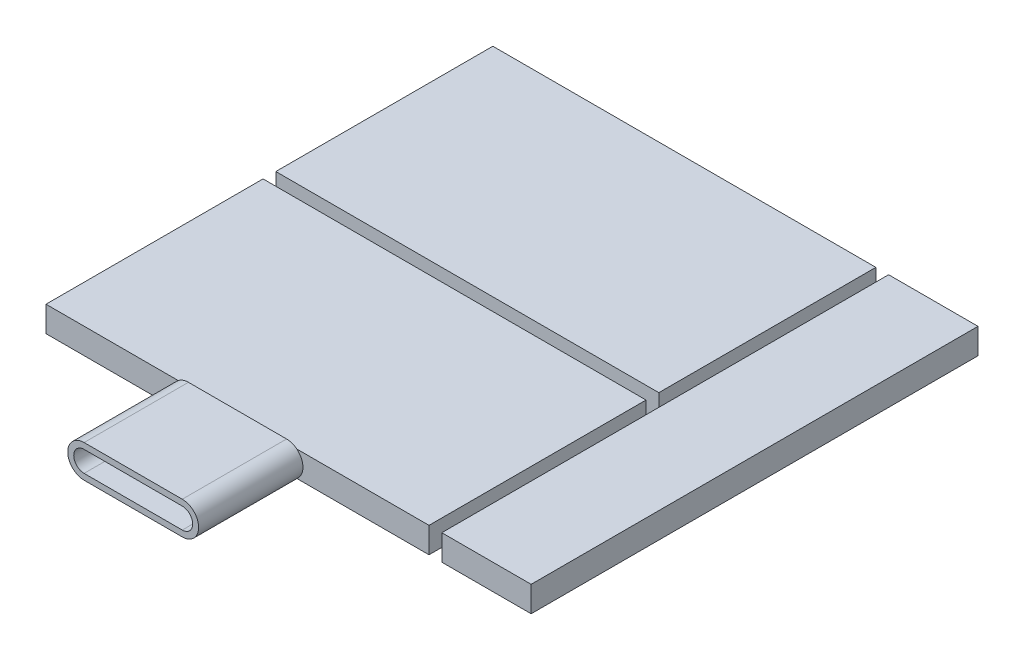
ISO-10303-21;
HEADER;
FILE_DESCRIPTION(('STEP AP214'),'2;1');
FILE_NAME('part.step','',(''),(''),'','','');
FILE_SCHEMA(('AUTOMOTIVE_DESIGN { 1 0 10303 214 1 1 1 1 }'));
ENDSEC;
DATA;
#1=APPLICATION_CONTEXT('core data for automotive mechanical design processes');
#2=APPLICATION_PROTOCOL_DEFINITION('international standard','automotive_design',2000,#1);
#3=PRODUCT_CONTEXT('',#1,'mechanical');
#4=PRODUCT('Part','Part','',(#3));
#5=PRODUCT_RELATED_PRODUCT_CATEGORY('part','',(#4));
#6=PRODUCT_DEFINITION_FORMATION('','',#4);
#7=PRODUCT_DEFINITION_CONTEXT('part definition',#1,'design');
#8=PRODUCT_DEFINITION('design','',#6,#7);
#9=PRODUCT_DEFINITION_SHAPE('','',#8);
#10=(LENGTH_UNIT() NAMED_UNIT(*) SI_UNIT(.MILLI.,.METRE.));
#11=(NAMED_UNIT(*) PLANE_ANGLE_UNIT() SI_UNIT($,.RADIAN.));
#12=(NAMED_UNIT(*) SI_UNIT($,.STERADIAN.) SOLID_ANGLE_UNIT());
#13=UNCERTAINTY_MEASURE_WITH_UNIT(LENGTH_MEASURE(1.E-05),#10,'distance_accuracy_value','');
#14=(GEOMETRIC_REPRESENTATION_CONTEXT(3) GLOBAL_UNCERTAINTY_ASSIGNED_CONTEXT((#13)) GLOBAL_UNIT_ASSIGNED_CONTEXT((#10,
#11,#12)) REPRESENTATION_CONTEXT('',''));
#15=CARTESIAN_POINT('',(0.,0.,0.));
#16=DIRECTION('',(0.,0.,1.));
#17=DIRECTION('',(1.,0.,0.));
#18=AXIS2_PLACEMENT_3D('',#15,#16,#17);
#19=CARTESIAN_POINT('',(-4.5,2.,17.5));
#20=DIRECTION('',(0.,0.,-1.));
#21=DIRECTION('',(-1.,0.,0.));
#22=AXIS2_PLACEMENT_3D('',#19,#20,#21);
#23=PLANE('',#22);
#24=CARTESIAN_POINT('',(-23.345,1.,17.5));
#25=DIRECTION('',(0.,0.,1.));
#26=DIRECTION('',(1.,0.,0.));
#27=AXIS2_PLACEMENT_3D('',#24,#25,#26);
#28=CIRCLE('',#27,1.28);
#29=CARTESIAN_POINT('',(-24.1439993742175,2.,17.5));
#30=VERTEX_POINT('',#29);
#31=CARTESIAN_POINT('',(-24.1439993742175,0.,17.5));
#32=VERTEX_POINT('',#31);
#33=EDGE_CURVE('E12',#30,#32,#28,.T.);
#34=ORIENTED_EDGE('',*,*,#33,.F.);
#35=DIRECTION('',(1.,0.,0.));
#36=VECTOR('',#35,1.);
#37=CARTESIAN_POINT('',(-4.5,2.,17.5));
#38=LINE('',#37,#36);
#39=CARTESIAN_POINT('',(-34.5,2.,17.5));
#40=VERTEX_POINT('',#39);
#41=EDGE_CURVE('E231',#40,#30,#38,.T.);
#42=ORIENTED_EDGE('',*,*,#41,.F.);
#43=DIRECTION('',(0.,-1.,0.));
#44=VECTOR('',#43,1.);
#45=CARTESIAN_POINT('',(-34.5,2.,17.5));
#46=LINE('',#45,#44);
#47=CARTESIAN_POINT('',(-34.5,0.,17.5));
#48=VERTEX_POINT('',#47);
#49=EDGE_CURVE('E246',#40,#48,#46,.T.);
#50=ORIENTED_EDGE('',*,*,#49,.T.);
#51=DIRECTION('',(1.,0.,0.));
#52=VECTOR('',#51,1.);
#53=CARTESIAN_POINT('',(-4.5,0.,17.5));
#54=LINE('',#53,#52);
#55=EDGE_CURVE('E226',#48,#32,#54,.T.);
#56=ORIENTED_EDGE('',*,*,#55,.T.);
#57=EDGE_LOOP('',(#34,#42,#50,#56));
#58=FACE_BOUND('',#57,.T.);
#59=ADVANCED_FACE('F46',(#58),#23,.F.);
#60=CARTESIAN_POINT('',(-15.655,1.,17.5));
#61=DIRECTION('',(0.,0.,1.));
#62=DIRECTION('',(1.,0.,0.));
#63=AXIS2_PLACEMENT_3D('',#60,#61,#62);
#64=CIRCLE('',#63,1.28);
#65=CARTESIAN_POINT('',(-14.8560006257825,0.,17.5));
#66=VERTEX_POINT('',#65);
#67=CARTESIAN_POINT('',(-14.8560006257825,2.,17.5));
#68=VERTEX_POINT('',#67);
#69=EDGE_CURVE('E55',#66,#68,#64,.T.);
#70=ORIENTED_EDGE('',*,*,#69,.F.);
#71=CARTESIAN_POINT('',(-4.5,0.,17.5));
#72=VERTEX_POINT('',#71);
#73=EDGE_CURVE('E241',#66,#72,#54,.T.);
#74=ORIENTED_EDGE('',*,*,#73,.T.);
#75=DIRECTION('',(0.,-1.,0.));
#76=VECTOR('',#75,1.);
#77=CARTESIAN_POINT('',(-4.5,2.,17.5));
#78=LINE('',#77,#76);
#79=CARTESIAN_POINT('',(-4.5,2.,17.5));
#80=VERTEX_POINT('',#79);
#81=EDGE_CURVE('E233',#80,#72,#78,.T.);
#82=ORIENTED_EDGE('',*,*,#81,.F.);
#83=EDGE_CURVE('E230',#68,#80,#38,.T.);
#84=ORIENTED_EDGE('',*,*,#83,.F.);
#85=EDGE_LOOP('',(#70,#74,#82,#84));
#86=FACE_BOUND('',#85,.T.);
#87=ADVANCED_FACE('F290',(#86),#23,.F.);
#88=CARTESIAN_POINT('',(-4.5,2.,17.5));
#89=DIRECTION('',(-1.,0.,0.));
#90=DIRECTION('',(0.,0.,1.));
#91=AXIS2_PLACEMENT_3D('',#88,#89,#90);
#92=PLANE('',#91);
#93=DIRECTION('',(0.,0.,-1.));
#94=VECTOR('',#93,1.);
#95=CARTESIAN_POINT('',(-4.5,0.,17.5));
#96=LINE('',#95,#94);
#97=CARTESIAN_POINT('',(-4.49999999999999,0.,0.499999999999997));
#98=VERTEX_POINT('',#97);
#99=EDGE_CURVE('E221',#72,#98,#96,.T.);
#100=ORIENTED_EDGE('',*,*,#99,.T.);
#101=DIRECTION('',(0.,-1.,0.));
#102=VECTOR('',#101,1.);
#103=CARTESIAN_POINT('',(-4.49999999999999,2.,0.499999999999997));
#104=LINE('',#103,#102);
#105=CARTESIAN_POINT('',(-4.49999999999999,2.,0.499999999999997));
#106=VERTEX_POINT('',#105);
#107=EDGE_CURVE('E50',#106,#98,#104,.T.);
#108=ORIENTED_EDGE('',*,*,#107,.F.);
#109=DIRECTION('',(0.,0.,-1.));
#110=VECTOR('',#109,1.);
#111=CARTESIAN_POINT('',(-4.5,2.,17.5));
#112=LINE('',#111,#110);
#113=EDGE_CURVE('E222',#80,#106,#112,.T.);
#114=ORIENTED_EDGE('',*,*,#113,.F.);
#115=ORIENTED_EDGE('',*,*,#81,.T.);
#116=EDGE_LOOP('',(#100,#108,#114,#115));
#117=FACE_BOUND('',#116,.T.);
#118=ADVANCED_FACE('F48',(#117),#92,.F.);
#119=CARTESIAN_POINT('',(-4.49999999999999,2.,0.499999999999997));
#120=DIRECTION('',(0.,0.,1.));
#121=DIRECTION('',(1.,0.,0.));
#122=AXIS2_PLACEMENT_3D('',#119,#120,#121);
#123=PLANE('',#122);
#124=DIRECTION('',(-1.,0.,0.));
#125=VECTOR('',#124,1.);
#126=CARTESIAN_POINT('',(-4.49999999999999,0.,0.499999999999997));
#127=LINE('',#126,#125);
#128=CARTESIAN_POINT('',(-34.5,0.,0.5));
#129=VERTEX_POINT('',#128);
#130=EDGE_CURVE('E237',#98,#129,#127,.T.);
#131=ORIENTED_EDGE('',*,*,#130,.T.);
#132=DIRECTION('',(0.,-1.,0.));
#133=VECTOR('',#132,1.);
#134=CARTESIAN_POINT('',(-34.5,2.,0.5));
#135=LINE('',#134,#133);
#136=CARTESIAN_POINT('',(-34.5,2.,0.5));
#137=VERTEX_POINT('',#136);
#138=EDGE_CURVE('E248',#137,#129,#135,.T.);
#139=ORIENTED_EDGE('',*,*,#138,.F.);
#140=DIRECTION('',(-1.,0.,0.));
#141=VECTOR('',#140,1.);
#142=CARTESIAN_POINT('',(-4.49999999999999,2.,0.499999999999997));
#143=LINE('',#142,#141);
#144=EDGE_CURVE('E225',#106,#137,#143,.T.);
#145=ORIENTED_EDGE('',*,*,#144,.F.);
#146=ORIENTED_EDGE('',*,*,#107,.T.);
#147=EDGE_LOOP('',(#131,#139,#145,#146));
#148=FACE_BOUND('',#147,.T.);
#149=ADVANCED_FACE('F296',(#148),#123,.F.);
#150=CARTESIAN_POINT('',(-34.5,2.,17.5));
#151=DIRECTION('',(1.,0.,0.));
#152=DIRECTION('',(0.,0.,-1.));
#153=AXIS2_PLACEMENT_3D('',#150,#151,#152);
#154=PLANE('',#153);
#155=DIRECTION('',(0.,0.,1.));
#156=VECTOR('',#155,1.);
#157=CARTESIAN_POINT('',(-34.5,0.,17.5));
#158=LINE('',#157,#156);
#159=EDGE_CURVE('E239',#129,#48,#158,.T.);
#160=ORIENTED_EDGE('',*,*,#159,.T.);
#161=ORIENTED_EDGE('',*,*,#49,.F.);
#162=DIRECTION('',(0.,0.,1.));
#163=VECTOR('',#162,1.);
#164=CARTESIAN_POINT('',(-34.5,2.,17.5));
#165=LINE('',#164,#163);
#166=EDGE_CURVE('E228',#137,#40,#165,.T.);
#167=ORIENTED_EDGE('',*,*,#166,.F.);
#168=ORIENTED_EDGE('',*,*,#138,.T.);
#169=EDGE_LOOP('',(#160,#161,#167,#168));
#170=FACE_BOUND('',#169,.T.);
#171=ADVANCED_FACE('F298',(#170),#154,.F.);
#172=CARTESIAN_POINT('',(0.,2.,0.));
#173=DIRECTION('',(0.,1.,0.));
#174=DIRECTION('',(0.,0.,1.));
#175=AXIS2_PLACEMENT_3D('',#172,#173,#174);
#176=PLANE('',#175);
#177=ORIENTED_EDGE('',*,*,#113,.T.);
#178=ORIENTED_EDGE('',*,*,#144,.T.);
#179=ORIENTED_EDGE('',*,*,#166,.T.);
#180=ORIENTED_EDGE('',*,*,#41,.T.);
#181=EDGE_CURVE('E234',#30,#68,#38,.T.);
#182=ORIENTED_EDGE('',*,*,#181,.T.);
#183=ORIENTED_EDGE('',*,*,#83,.T.);
#184=EDGE_LOOP('',(#177,#178,#179,#180,#182,#183));
#185=FACE_BOUND('',#184,.T.);
#186=ADVANCED_FACE('F300',(#185),#176,.T.);
#187=CARTESIAN_POINT('',(0.,0.,0.));
#188=DIRECTION('',(0.,1.,0.));
#189=DIRECTION('',(0.,0.,1.));
#190=AXIS2_PLACEMENT_3D('',#187,#188,#189);
#191=PLANE('',#190);
#192=ORIENTED_EDGE('',*,*,#99,.F.);
#193=ORIENTED_EDGE('',*,*,#73,.F.);
#194=EDGE_CURVE('E243',#32,#66,#54,.T.);
#195=ORIENTED_EDGE('',*,*,#194,.F.);
#196=ORIENTED_EDGE('',*,*,#55,.F.);
#197=ORIENTED_EDGE('',*,*,#159,.F.);
#198=ORIENTED_EDGE('',*,*,#130,.F.);
#199=EDGE_LOOP('',(#192,#193,#195,#196,#197,#198));
#200=FACE_BOUND('',#199,.T.);
#201=ADVANCED_FACE('F295',(#200),#191,.F.);
#202=CARTESIAN_POINT('',(-23.345,1.,17.5));
#203=DIRECTION('',(0.,0.,1.));
#204=DIRECTION('',(1.,0.,0.));
#205=AXIS2_PLACEMENT_3D('',#202,#203,#204);
#206=PLANE('',#205);
#207=CARTESIAN_POINT('',(-23.345,-0.279999999999999,17.5));
#208=VERTEX_POINT('',#207);
#209=EDGE_CURVE('E58',#32,#208,#28,.T.);
#210=ORIENTED_EDGE('',*,*,#209,.F.);
#211=ORIENTED_EDGE('',*,*,#194,.T.);
#212=CARTESIAN_POINT('',(-15.655,-0.279999999999998,17.5));
#213=VERTEX_POINT('',#212);
#214=EDGE_CURVE('E206',#213,#66,#64,.T.);
#215=ORIENTED_EDGE('',*,*,#214,.F.);
#216=DIRECTION('',(1.,0.,0.));
#217=VECTOR('',#216,1.);
#218=CARTESIAN_POINT('',(-23.345,-0.279999999999999,17.5));
#219=LINE('',#218,#217);
#220=EDGE_CURVE('E203',#208,#213,#219,.T.);
#221=ORIENTED_EDGE('',*,*,#220,.F.);
#222=EDGE_LOOP('',(#210,#211,#215,#221));
#223=FACE_BOUND('',#222,.T.);
#224=ADVANCED_FACE('F284',(#223),#206,.F.);
#225=CARTESIAN_POINT('',(-23.345,1.,25.67));
#226=DIRECTION('',(0.,0.,1.));
#227=DIRECTION('',(1.,0.,0.));
#228=AXIS2_PLACEMENT_3D('',#225,#226,#227);
#229=PLANE('',#228);
#230=CARTESIAN_POINT('',(-23.345,1.,25.67));
#231=DIRECTION('',(0.,0.,1.));
#232=DIRECTION('',(1.,0.,0.));
#233=AXIS2_PLACEMENT_3D('',#230,#231,#232);
#234=CIRCLE('',#233,1.28);
#235=CARTESIAN_POINT('',(-23.345,2.28,25.67));
#236=VERTEX_POINT('',#235);
#237=CARTESIAN_POINT('',(-23.345,-0.279999999999999,25.67));
#238=VERTEX_POINT('',#237);
#239=EDGE_CURVE('E191',#236,#238,#234,.T.);
#240=ORIENTED_EDGE('',*,*,#239,.T.);
#241=DIRECTION('',(1.,0.,0.));
#242=VECTOR('',#241,1.);
#243=CARTESIAN_POINT('',(-23.345,-0.279999999999999,25.67));
#244=LINE('',#243,#242);
#245=CARTESIAN_POINT('',(-15.655,-0.279999999999998,25.67));
#246=VERTEX_POINT('',#245);
#247=EDGE_CURVE('E194',#238,#246,#244,.T.);
#248=ORIENTED_EDGE('',*,*,#247,.T.);
#249=CARTESIAN_POINT('',(-15.655,1.,25.67));
#250=DIRECTION('',(0.,0.,1.));
#251=DIRECTION('',(1.,0.,0.));
#252=AXIS2_PLACEMENT_3D('',#249,#250,#251);
#253=CIRCLE('',#252,1.28);
#254=CARTESIAN_POINT('',(-15.655,2.28,25.67));
#255=VERTEX_POINT('',#254);
#256=EDGE_CURVE('E197',#246,#255,#253,.T.);
#257=ORIENTED_EDGE('',*,*,#256,.T.);
#258=DIRECTION('',(-1.,0.,0.));
#259=VECTOR('',#258,1.);
#260=CARTESIAN_POINT('',(-23.345,2.28,25.67));
#261=LINE('',#260,#259);
#262=EDGE_CURVE('E199',#255,#236,#261,.T.);
#263=ORIENTED_EDGE('',*,*,#262,.T.);
#264=EDGE_LOOP('',(#240,#248,#257,#263));
#265=FACE_BOUND('',#264,.T.);
#266=DIRECTION('',(1.,0.,0.));
#267=VECTOR('',#266,1.);
#268=CARTESIAN_POINT('',(-23.345,0.187609999517717,25.67));
#269=LINE('',#268,#267);
#270=CARTESIAN_POINT('',(-23.345,0.187609999517717,25.67));
#271=VERTEX_POINT('',#270);
#272=CARTESIAN_POINT('',(-15.655,0.187609999517718,25.67));
#273=VERTEX_POINT('',#272);
#274=EDGE_CURVE('E160',#271,#273,#269,.T.);
#275=ORIENTED_EDGE('',*,*,#274,.F.);
#276=CARTESIAN_POINT('',(-23.345,1.,25.67));
#277=DIRECTION('',(0.,0.,1.));
#278=DIRECTION('',(1.,0.,0.));
#279=AXIS2_PLACEMENT_3D('',#276,#277,#278);
#280=CIRCLE('',#279,0.812390000482283);
#281=CARTESIAN_POINT('',(-23.345,1.81239000048228,25.67));
#282=VERTEX_POINT('',#281);
#283=EDGE_CURVE('E152',#282,#271,#280,.T.);
#284=ORIENTED_EDGE('',*,*,#283,.F.);
#285=DIRECTION('',(-1.,0.,0.));
#286=VECTOR('',#285,1.);
#287=CARTESIAN_POINT('',(-23.345,1.81239000048228,25.67));
#288=LINE('',#287,#286);
#289=CARTESIAN_POINT('',(-15.655,1.81239000048228,25.67));
#290=VERTEX_POINT('',#289);
#291=EDGE_CURVE('E175',#290,#282,#288,.T.);
#292=ORIENTED_EDGE('',*,*,#291,.F.);
#293=CARTESIAN_POINT('',(-15.655,1.,25.67));
#294=DIRECTION('',(0.,0.,1.));
#295=DIRECTION('',(1.,0.,0.));
#296=AXIS2_PLACEMENT_3D('',#293,#294,#295);
#297=CIRCLE('',#296,0.812390000482283);
#298=EDGE_CURVE('E173',#273,#290,#297,.T.);
#299=ORIENTED_EDGE('',*,*,#298,.F.);
#300=EDGE_LOOP('',(#275,#284,#292,#299));
#301=FACE_BOUND('',#300,.T.);
#302=ADVANCED_FACE('F171',(#265,#301),#229,.T.);
#303=ORIENTED_EDGE('',*,*,#181,.F.);
#304=CARTESIAN_POINT('',(-23.345,2.28,17.5));
#305=VERTEX_POINT('',#304);
#306=EDGE_CURVE('E57',#305,#30,#28,.T.);
#307=ORIENTED_EDGE('',*,*,#306,.F.);
#308=DIRECTION('',(-1.,0.,0.));
#309=VECTOR('',#308,1.);
#310=CARTESIAN_POINT('',(-23.345,2.28,17.5));
#311=LINE('',#310,#309);
#312=CARTESIAN_POINT('',(-15.655,2.28,17.5));
#313=VERTEX_POINT('',#312);
#314=EDGE_CURVE('E195',#313,#305,#311,.T.);
#315=ORIENTED_EDGE('',*,*,#314,.F.);
#316=EDGE_CURVE('E205',#68,#313,#64,.T.);
#317=ORIENTED_EDGE('',*,*,#316,.F.);
#318=EDGE_LOOP('',(#303,#307,#315,#317));
#319=FACE_BOUND('',#318,.T.);
#320=ADVANCED_FACE('F271',(#319),#206,.F.);
#321=CARTESIAN_POINT('',(-23.345,1.,25.67));
#322=DIRECTION('',(0.,0.,-1.));
#323=DIRECTION('',(-1.,0.,0.));
#324=AXIS2_PLACEMENT_3D('',#321,#322,#323);
#325=CYLINDRICAL_SURFACE('',#324,1.28);
#326=ORIENTED_EDGE('',*,*,#306,.T.);
#327=ORIENTED_EDGE('',*,*,#33,.T.);
#328=ORIENTED_EDGE('',*,*,#209,.T.);
#329=DIRECTION('',(0.,0.,-1.));
#330=VECTOR('',#329,1.);
#331=CARTESIAN_POINT('',(-23.345,-0.279999999999999,25.67));
#332=LINE('',#331,#330);
#333=EDGE_CURVE('E218',#238,#208,#332,.T.);
#334=ORIENTED_EDGE('',*,*,#333,.F.);
#335=ORIENTED_EDGE('',*,*,#239,.F.);
#336=DIRECTION('',(0.,0.,-1.));
#337=VECTOR('',#336,1.);
#338=CARTESIAN_POINT('',(-23.345,2.28,25.67));
#339=LINE('',#338,#337);
#340=EDGE_CURVE('E200',#236,#305,#339,.T.);
#341=ORIENTED_EDGE('',*,*,#340,.T.);
#342=EDGE_LOOP('',(#326,#327,#328,#334,#335,#341));
#343=FACE_BOUND('',#342,.T.);
#344=ADVANCED_FACE('F273',(#343),#325,.T.);
#345=CARTESIAN_POINT('',(-23.345,-0.279999999999999,25.67));
#346=DIRECTION('',(0.,1.,0.));
#347=DIRECTION('',(-1.,0.,0.));
#348=AXIS2_PLACEMENT_3D('',#345,#346,#347);
#349=PLANE('',#348);
#350=ORIENTED_EDGE('',*,*,#220,.T.);
#351=DIRECTION('',(0.,0.,-1.));
#352=VECTOR('',#351,1.);
#353=CARTESIAN_POINT('',(-15.655,-0.279999999999998,25.67));
#354=LINE('',#353,#352);
#355=EDGE_CURVE('E215',#246,#213,#354,.T.);
#356=ORIENTED_EDGE('',*,*,#355,.F.);
#357=ORIENTED_EDGE('',*,*,#247,.F.);
#358=ORIENTED_EDGE('',*,*,#333,.T.);
#359=EDGE_LOOP('',(#350,#356,#357,#358));
#360=FACE_BOUND('',#359,.T.);
#361=ADVANCED_FACE('F336',(#360),#349,.F.);
#362=CARTESIAN_POINT('',(-15.655,1.,25.67));
#363=DIRECTION('',(0.,0.,-1.));
#364=DIRECTION('',(-1.,0.,0.));
#365=AXIS2_PLACEMENT_3D('',#362,#363,#364);
#366=CYLINDRICAL_SURFACE('',#365,1.28);
#367=ORIENTED_EDGE('',*,*,#214,.T.);
#368=ORIENTED_EDGE('',*,*,#69,.T.);
#369=ORIENTED_EDGE('',*,*,#316,.T.);
#370=DIRECTION('',(0.,0.,-1.));
#371=VECTOR('',#370,1.);
#372=CARTESIAN_POINT('',(-15.655,2.28,25.67));
#373=LINE('',#372,#371);
#374=EDGE_CURVE('E212',#255,#313,#373,.T.);
#375=ORIENTED_EDGE('',*,*,#374,.F.);
#376=ORIENTED_EDGE('',*,*,#256,.F.);
#377=ORIENTED_EDGE('',*,*,#355,.T.);
#378=EDGE_LOOP('',(#367,#368,#369,#375,#376,#377));
#379=FACE_BOUND('',#378,.T.);
#380=ADVANCED_FACE('F261',(#379),#366,.T.);
#381=CARTESIAN_POINT('',(-23.345,2.28,25.67));
#382=DIRECTION('',(0.,-1.,0.));
#383=DIRECTION('',(1.,0.,0.));
#384=AXIS2_PLACEMENT_3D('',#381,#382,#383);
#385=PLANE('',#384);
#386=ORIENTED_EDGE('',*,*,#314,.T.);
#387=ORIENTED_EDGE('',*,*,#340,.F.);
#388=ORIENTED_EDGE('',*,*,#262,.F.);
#389=ORIENTED_EDGE('',*,*,#374,.T.);
#390=EDGE_LOOP('',(#386,#387,#388,#389));
#391=FACE_BOUND('',#390,.T.);
#392=ADVANCED_FACE('F268',(#391),#385,.F.);
#393=CARTESIAN_POINT('',(-23.345,1.,25.67));
#394=DIRECTION('',(0.,0.,-1.));
#395=DIRECTION('',(-1.,0.,0.));
#396=AXIS2_PLACEMENT_3D('',#393,#394,#395);
#397=CYLINDRICAL_SURFACE('',#396,0.812390000482283);
#398=CARTESIAN_POINT('',(-23.345,1.,17.5));
#399=DIRECTION('',(0.,0.,1.));
#400=DIRECTION('',(1.,0.,0.));
#401=AXIS2_PLACEMENT_3D('',#398,#399,#400);
#402=CIRCLE('',#401,0.812390000482283);
#403=CARTESIAN_POINT('',(-23.345,1.81239000048228,17.5));
#404=VERTEX_POINT('',#403);
#405=CARTESIAN_POINT('',(-23.345,0.187609999517717,17.5));
#406=VERTEX_POINT('',#405);
#407=EDGE_CURVE('E179',#404,#406,#402,.T.);
#408=ORIENTED_EDGE('',*,*,#407,.F.);
#409=DIRECTION('',(0.,0.,-1.));
#410=VECTOR('',#409,1.);
#411=CARTESIAN_POINT('',(-23.345,1.81239000048228,25.67));
#412=LINE('',#411,#410);
#413=EDGE_CURVE('E65',#282,#404,#412,.T.);
#414=ORIENTED_EDGE('',*,*,#413,.F.);
#415=ORIENTED_EDGE('',*,*,#283,.T.);
#416=DIRECTION('',(0.,0.,-1.));
#417=VECTOR('',#416,1.);
#418=CARTESIAN_POINT('',(-23.345,0.187609999517717,25.67));
#419=LINE('',#418,#417);
#420=EDGE_CURVE('E155',#271,#406,#419,.T.);
#421=ORIENTED_EDGE('',*,*,#420,.T.);
#422=EDGE_LOOP('',(#408,#414,#415,#421));
#423=FACE_BOUND('',#422,.T.);
#424=ADVANCED_FACE('F154',(#423),#397,.F.);
#425=CARTESIAN_POINT('',(-23.345,0.187609999517717,25.67));
#426=DIRECTION('',(0.,1.,0.));
#427=DIRECTION('',(-1.,0.,0.));
#428=AXIS2_PLACEMENT_3D('',#425,#426,#427);
#429=PLANE('',#428);
#430=DIRECTION('',(1.,0.,0.));
#431=VECTOR('',#430,1.);
#432=CARTESIAN_POINT('',(-23.345,0.187609999517717,17.5));
#433=LINE('',#432,#431);
#434=CARTESIAN_POINT('',(-15.655,0.187609999517718,17.5));
#435=VERTEX_POINT('',#434);
#436=EDGE_CURVE('E167',#406,#435,#433,.T.);
#437=ORIENTED_EDGE('',*,*,#436,.F.);
#438=ORIENTED_EDGE('',*,*,#420,.F.);
#439=ORIENTED_EDGE('',*,*,#274,.T.);
#440=DIRECTION('',(0.,0.,-1.));
#441=VECTOR('',#440,1.);
#442=CARTESIAN_POINT('',(-15.655,0.187609999517718,25.67));
#443=LINE('',#442,#441);
#444=EDGE_CURVE('E168',#273,#435,#443,.T.);
#445=ORIENTED_EDGE('',*,*,#444,.T.);
#446=EDGE_LOOP('',(#437,#438,#439,#445));
#447=FACE_BOUND('',#446,.T.);
#448=ADVANCED_FACE('F164',(#447),#429,.T.);
#449=CARTESIAN_POINT('',(-15.655,1.,25.67));
#450=DIRECTION('',(0.,0.,-1.));
#451=DIRECTION('',(-1.,0.,0.));
#452=AXIS2_PLACEMENT_3D('',#449,#450,#451);
#453=CYLINDRICAL_SURFACE('',#452,0.812390000482283);
#454=CARTESIAN_POINT('',(-15.655,1.,17.5));
#455=DIRECTION('',(0.,0.,1.));
#456=DIRECTION('',(1.,0.,0.));
#457=AXIS2_PLACEMENT_3D('',#454,#455,#456);
#458=CIRCLE('',#457,0.812390000482283);
#459=CARTESIAN_POINT('',(-15.655,1.81239000048228,17.5));
#460=VERTEX_POINT('',#459);
#461=EDGE_CURVE('E182',#435,#460,#458,.T.);
#462=ORIENTED_EDGE('',*,*,#461,.F.);
#463=ORIENTED_EDGE('',*,*,#444,.F.);
#464=ORIENTED_EDGE('',*,*,#298,.T.);
#465=DIRECTION('',(0.,0.,-1.));
#466=VECTOR('',#465,1.);
#467=CARTESIAN_POINT('',(-15.655,1.81239000048228,25.67));
#468=LINE('',#467,#466);
#469=EDGE_CURVE('E188',#290,#460,#468,.T.);
#470=ORIENTED_EDGE('',*,*,#469,.T.);
#471=EDGE_LOOP('',(#462,#463,#464,#470));
#472=FACE_BOUND('',#471,.T.);
#473=ADVANCED_FACE('F315',(#472),#453,.F.);
#474=CARTESIAN_POINT('',(-23.345,1.81239000048228,25.67));
#475=DIRECTION('',(0.,-1.,0.));
#476=DIRECTION('',(1.,0.,0.));
#477=AXIS2_PLACEMENT_3D('',#474,#475,#476);
#478=PLANE('',#477);
#479=DIRECTION('',(-1.,0.,0.));
#480=VECTOR('',#479,1.);
#481=CARTESIAN_POINT('',(-23.345,1.81239000048228,17.5));
#482=LINE('',#481,#480);
#483=EDGE_CURVE('E161',#460,#404,#482,.T.);
#484=ORIENTED_EDGE('',*,*,#483,.F.);
#485=ORIENTED_EDGE('',*,*,#469,.F.);
#486=ORIENTED_EDGE('',*,*,#291,.T.);
#487=ORIENTED_EDGE('',*,*,#413,.T.);
#488=EDGE_LOOP('',(#484,#485,#486,#487));
#489=FACE_BOUND('',#488,.T.);
#490=ADVANCED_FACE('F310',(#489),#478,.T.);
#491=ORIENTED_EDGE('',*,*,#483,.T.);
#492=ORIENTED_EDGE('',*,*,#407,.T.);
#493=ORIENTED_EDGE('',*,*,#436,.T.);
#494=ORIENTED_EDGE('',*,*,#461,.T.);
#495=EDGE_LOOP('',(#491,#492,#493,#494));
#496=FACE_BOUND('',#495,.T.);
#497=ADVANCED_FACE('F303',(#496),#23,.F.);
#498=CLOSED_SHELL('',(#59,#87,#118,#149,#171,#186,#201,#224,#302,#320,#344,#361,#380,#392,#424,
#448,#473,#490,#497));
#499=MANIFOLD_SOLID_BREP('B2',#498);
#500=CARTESIAN_POINT('',(-4.5,2.,-17.5));
#501=DIRECTION('',(-1.,0.,0.));
#502=DIRECTION('',(0.,0.,1.));
#503=AXIS2_PLACEMENT_3D('',#500,#501,#502);
#504=PLANE('',#503);
#505=DIRECTION('',(0.,0.,-1.));
#506=VECTOR('',#505,1.);
#507=CARTESIAN_POINT('',(-4.5,0.,-17.5));
#508=LINE('',#507,#506);
#509=CARTESIAN_POINT('',(-4.5,0.,-0.500000000000008));
#510=VERTEX_POINT('',#509);
#511=CARTESIAN_POINT('',(-4.5,0.,-17.5));
#512=VERTEX_POINT('',#511);
#513=EDGE_CURVE('E530',#510,#512,#508,.T.);
#514=ORIENTED_EDGE('',*,*,#513,.T.);
#515=DIRECTION('',(0.,-1.,0.));
#516=VECTOR('',#515,1.);
#517=CARTESIAN_POINT('',(-4.5,2.,-17.5));
#518=LINE('',#517,#516);
#519=CARTESIAN_POINT('',(-4.5,2.,-17.5));
#520=VERTEX_POINT('',#519);
#521=EDGE_CURVE('E44',#520,#512,#518,.T.);
#522=ORIENTED_EDGE('',*,*,#521,.F.);
#523=DIRECTION('',(0.,0.,-1.));
#524=VECTOR('',#523,1.);
#525=CARTESIAN_POINT('',(-4.5,2.,-17.5));
#526=LINE('',#525,#524);
#527=CARTESIAN_POINT('',(-4.5,2.,-0.500000000000008));
#528=VERTEX_POINT('',#527);
#529=EDGE_CURVE('E518',#528,#520,#526,.T.);
#530=ORIENTED_EDGE('',*,*,#529,.F.);
#531=DIRECTION('',(0.,-1.,0.));
#532=VECTOR('',#531,1.);
#533=CARTESIAN_POINT('',(-4.5,2.,-0.500000000000008));
#534=LINE('',#533,#532);
#535=EDGE_CURVE('E526',#528,#510,#534,.T.);
#536=ORIENTED_EDGE('',*,*,#535,.T.);
#537=EDGE_LOOP('',(#514,#522,#530,#536));
#538=FACE_BOUND('',#537,.T.);
#539=ADVANCED_FACE('F467',(#538),#504,.F.);
#540=CARTESIAN_POINT('',(-4.5,2.,-17.5));
#541=DIRECTION('',(0.,0.,1.));
#542=DIRECTION('',(1.,0.,0.));
#543=AXIS2_PLACEMENT_3D('',#540,#541,#542);
#544=PLANE('',#543);
#545=DIRECTION('',(-1.,0.,0.));
#546=VECTOR('',#545,1.);
#547=CARTESIAN_POINT('',(-4.5,0.,-17.5));
#548=LINE('',#547,#546);
#549=CARTESIAN_POINT('',(-34.5,0.,-17.5));
#550=VERTEX_POINT('',#549);
#551=EDGE_CURVE('E522',#512,#550,#548,.T.);
#552=ORIENTED_EDGE('',*,*,#551,.T.);
#553=DIRECTION('',(0.,-1.,0.));
#554=VECTOR('',#553,1.);
#555=CARTESIAN_POINT('',(-34.5,2.,-17.5));
#556=LINE('',#555,#554);
#557=CARTESIAN_POINT('',(-34.5,2.,-17.5));
#558=VERTEX_POINT('',#557);
#559=EDGE_CURVE('E475',#558,#550,#556,.T.);
#560=ORIENTED_EDGE('',*,*,#559,.F.);
#561=DIRECTION('',(-1.,0.,0.));
#562=VECTOR('',#561,1.);
#563=CARTESIAN_POINT('',(-4.5,2.,-17.5));
#564=LINE('',#563,#562);
#565=EDGE_CURVE('E513',#520,#558,#564,.T.);
#566=ORIENTED_EDGE('',*,*,#565,.F.);
#567=ORIENTED_EDGE('',*,*,#521,.T.);
#568=EDGE_LOOP('',(#552,#560,#566,#567));
#569=FACE_BOUND('',#568,.T.);
#570=ADVANCED_FACE('F521',(#569),#544,.F.);
#571=CARTESIAN_POINT('',(-34.5,2.,-17.5));
#572=DIRECTION('',(1.,0.,0.));
#573=DIRECTION('',(0.,0.,-1.));
#574=AXIS2_PLACEMENT_3D('',#571,#572,#573);
#575=PLANE('',#574);
#576=DIRECTION('',(0.,0.,1.));
#577=VECTOR('',#576,1.);
#578=CARTESIAN_POINT('',(-34.5,0.,-17.5));
#579=LINE('',#578,#577);
#580=CARTESIAN_POINT('',(-34.5,0.,-0.500000000000004));
#581=VERTEX_POINT('',#580);
#582=EDGE_CURVE('E500',#550,#581,#579,.T.);
#583=ORIENTED_EDGE('',*,*,#582,.T.);
#584=DIRECTION('',(0.,-1.,0.));
#585=VECTOR('',#584,1.);
#586=CARTESIAN_POINT('',(-34.5,2.,-0.500000000000004));
#587=LINE('',#586,#585);
#588=CARTESIAN_POINT('',(-34.5,2.,-0.500000000000004));
#589=VERTEX_POINT('',#588);
#590=EDGE_CURVE('E523',#589,#581,#587,.T.);
#591=ORIENTED_EDGE('',*,*,#590,.F.);
#592=DIRECTION('',(0.,0.,1.));
#593=VECTOR('',#592,1.);
#594=CARTESIAN_POINT('',(-34.5,2.,-17.5));
#595=LINE('',#594,#593);
#596=EDGE_CURVE('E516',#558,#589,#595,.T.);
#597=ORIENTED_EDGE('',*,*,#596,.F.);
#598=ORIENTED_EDGE('',*,*,#559,.T.);
#599=EDGE_LOOP('',(#583,#591,#597,#598));
#600=FACE_BOUND('',#599,.T.);
#601=ADVANCED_FACE('F524',(#600),#575,.F.);
#602=CARTESIAN_POINT('',(-4.5,2.,-0.500000000000008));
#603=DIRECTION('',(0.,0.,-1.));
#604=DIRECTION('',(-1.,0.,0.));
#605=AXIS2_PLACEMENT_3D('',#602,#603,#604);
#606=PLANE('',#605);
#607=DIRECTION('',(1.,0.,0.));
#608=VECTOR('',#607,1.);
#609=CARTESIAN_POINT('',(-4.5,0.,-0.500000000000008));
#610=LINE('',#609,#608);
#611=EDGE_CURVE('E506',#581,#510,#610,.T.);
#612=ORIENTED_EDGE('',*,*,#611,.T.);
#613=ORIENTED_EDGE('',*,*,#535,.F.);
#614=DIRECTION('',(1.,0.,0.));
#615=VECTOR('',#614,1.);
#616=CARTESIAN_POINT('',(-4.5,2.,-0.500000000000008));
#617=LINE('',#616,#615);
#618=EDGE_CURVE('E483',#589,#528,#617,.T.);
#619=ORIENTED_EDGE('',*,*,#618,.F.);
#620=ORIENTED_EDGE('',*,*,#590,.T.);
#621=EDGE_LOOP('',(#612,#613,#619,#620));
#622=FACE_BOUND('',#621,.T.);
#623=ADVANCED_FACE('F537',(#622),#606,.F.);
#624=CARTESIAN_POINT('',(0.,2.,0.));
#625=DIRECTION('',(0.,-1.,0.));
#626=DIRECTION('',(0.,0.,-1.));
#627=AXIS2_PLACEMENT_3D('',#624,#625,#626);
#628=PLANE('',#627);
#629=ORIENTED_EDGE('',*,*,#529,.T.);
#630=ORIENTED_EDGE('',*,*,#565,.T.);
#631=ORIENTED_EDGE('',*,*,#596,.T.);
#632=ORIENTED_EDGE('',*,*,#618,.T.);
#633=EDGE_LOOP('',(#629,#630,#631,#632));
#634=FACE_BOUND('',#633,.T.);
#635=ADVANCED_FACE('F514',(#634),#628,.F.);
#636=CARTESIAN_POINT('',(0.,0.,0.));
#637=DIRECTION('',(0.,-1.,0.));
#638=DIRECTION('',(0.,0.,-1.));
#639=AXIS2_PLACEMENT_3D('',#636,#637,#638);
#640=PLANE('',#639);
#641=ORIENTED_EDGE('',*,*,#513,.F.);
#642=ORIENTED_EDGE('',*,*,#611,.F.);
#643=ORIENTED_EDGE('',*,*,#582,.F.);
#644=ORIENTED_EDGE('',*,*,#551,.F.);
#645=EDGE_LOOP('',(#641,#642,#643,#644));
#646=FACE_BOUND('',#645,.T.);
#647=ADVANCED_FACE('F540',(#646),#640,.T.);
#648=CLOSED_SHELL('',(#539,#570,#601,#623,#635,#647));
#649=MANIFOLD_SOLID_BREP('B6',#648);
#650=CARTESIAN_POINT('',(3.5,2.,17.5));
#651=DIRECTION('',(-1.,0.,0.));
#652=DIRECTION('',(0.,0.,1.));
#653=AXIS2_PLACEMENT_3D('',#650,#651,#652);
#654=PLANE('',#653);
#655=DIRECTION('',(0.,0.,-1.));
#656=VECTOR('',#655,1.);
#657=CARTESIAN_POINT('',(3.5,0.,17.5));
#658=LINE('',#657,#656);
#659=CARTESIAN_POINT('',(3.5,0.,17.5));
#660=VERTEX_POINT('',#659);
#661=CARTESIAN_POINT('',(3.5,0.,-17.5));
#662=VERTEX_POINT('',#661);
#663=EDGE_CURVE('E654',#660,#662,#658,.T.);
#664=ORIENTED_EDGE('',*,*,#663,.T.);
#665=DIRECTION('',(0.,-1.,0.));
#666=VECTOR('',#665,1.);
#667=CARTESIAN_POINT('',(3.5,2.,-17.5));
#668=LINE('',#667,#666);
#669=CARTESIAN_POINT('',(3.5,2.,-17.5));
#670=VERTEX_POINT('',#669);
#671=EDGE_CURVE('E465',#670,#662,#668,.T.);
#672=ORIENTED_EDGE('',*,*,#671,.F.);
#673=DIRECTION('',(0.,0.,-1.));
#674=VECTOR('',#673,1.);
#675=CARTESIAN_POINT('',(3.5,2.,17.5));
#676=LINE('',#675,#674);
#677=CARTESIAN_POINT('',(3.5,2.,17.5));
#678=VERTEX_POINT('',#677);
#679=EDGE_CURVE('E642',#678,#670,#676,.T.);
#680=ORIENTED_EDGE('',*,*,#679,.F.);
#681=DIRECTION('',(0.,-1.,0.));
#682=VECTOR('',#681,1.);
#683=CARTESIAN_POINT('',(3.5,2.,17.5));
#684=LINE('',#683,#682);
#685=EDGE_CURVE('E650',#678,#660,#684,.T.);
#686=ORIENTED_EDGE('',*,*,#685,.T.);
#687=EDGE_LOOP('',(#664,#672,#680,#686));
#688=FACE_BOUND('',#687,.T.);
#689=ADVANCED_FACE('F591',(#688),#654,.F.);
#690=CARTESIAN_POINT('',(-3.5,2.,-17.5));
#691=DIRECTION('',(0.,0.,1.));
#692=DIRECTION('',(1.,0.,0.));
#693=AXIS2_PLACEMENT_3D('',#690,#691,#692);
#694=PLANE('',#693);
#695=DIRECTION('',(-1.,0.,0.));
#696=VECTOR('',#695,1.);
#697=CARTESIAN_POINT('',(-3.5,0.,-17.5));
#698=LINE('',#697,#696);
#699=CARTESIAN_POINT('',(-3.5,0.,-17.5));
#700=VERTEX_POINT('',#699);
#701=EDGE_CURVE('E646',#662,#700,#698,.T.);
#702=ORIENTED_EDGE('',*,*,#701,.T.);
#703=DIRECTION('',(0.,-1.,0.));
#704=VECTOR('',#703,1.);
#705=CARTESIAN_POINT('',(-3.5,2.,-17.5));
#706=LINE('',#705,#704);
#707=CARTESIAN_POINT('',(-3.5,2.,-17.5));
#708=VERTEX_POINT('',#707);
#709=EDGE_CURVE('E599',#708,#700,#706,.T.);
#710=ORIENTED_EDGE('',*,*,#709,.F.);
#711=DIRECTION('',(-1.,0.,0.));
#712=VECTOR('',#711,1.);
#713=CARTESIAN_POINT('',(-3.5,2.,-17.5));
#714=LINE('',#713,#712);
#715=EDGE_CURVE('E637',#670,#708,#714,.T.);
#716=ORIENTED_EDGE('',*,*,#715,.F.);
#717=ORIENTED_EDGE('',*,*,#671,.T.);
#718=EDGE_LOOP('',(#702,#710,#716,#717));
#719=FACE_BOUND('',#718,.T.);
#720=ADVANCED_FACE('F645',(#719),#694,.F.);
#721=CARTESIAN_POINT('',(-3.5,2.,17.5));
#722=DIRECTION('',(1.,0.,0.));
#723=DIRECTION('',(0.,0.,-1.));
#724=AXIS2_PLACEMENT_3D('',#721,#722,#723);
#725=PLANE('',#724);
#726=DIRECTION('',(0.,0.,1.));
#727=VECTOR('',#726,1.);
#728=CARTESIAN_POINT('',(-3.5,0.,17.5));
#729=LINE('',#728,#727);
#730=CARTESIAN_POINT('',(-3.5,0.,17.5));
#731=VERTEX_POINT('',#730);
#732=EDGE_CURVE('E624',#700,#731,#729,.T.);
#733=ORIENTED_EDGE('',*,*,#732,.T.);
#734=DIRECTION('',(0.,-1.,0.));
#735=VECTOR('',#734,1.);
#736=CARTESIAN_POINT('',(-3.5,2.,17.5));
#737=LINE('',#736,#735);
#738=CARTESIAN_POINT('',(-3.5,2.,17.5));
#739=VERTEX_POINT('',#738);
#740=EDGE_CURVE('E647',#739,#731,#737,.T.);
#741=ORIENTED_EDGE('',*,*,#740,.F.);
#742=DIRECTION('',(0.,0.,1.));
#743=VECTOR('',#742,1.);
#744=CARTESIAN_POINT('',(-3.5,2.,17.5));
#745=LINE('',#744,#743);
#746=EDGE_CURVE('E640',#708,#739,#745,.T.);
#747=ORIENTED_EDGE('',*,*,#746,.F.);
#748=ORIENTED_EDGE('',*,*,#709,.T.);
#749=EDGE_LOOP('',(#733,#741,#747,#748));
#750=FACE_BOUND('',#749,.T.);
#751=ADVANCED_FACE('F648',(#750),#725,.F.);
#752=CARTESIAN_POINT('',(-3.5,2.,17.5));
#753=DIRECTION('',(0.,0.,-1.));
#754=DIRECTION('',(-1.,0.,0.));
#755=AXIS2_PLACEMENT_3D('',#752,#753,#754);
#756=PLANE('',#755);
#757=DIRECTION('',(1.,0.,0.));
#758=VECTOR('',#757,1.);
#759=CARTESIAN_POINT('',(-3.5,0.,17.5));
#760=LINE('',#759,#758);
#761=EDGE_CURVE('E630',#731,#660,#760,.T.);
#762=ORIENTED_EDGE('',*,*,#761,.T.);
#763=ORIENTED_EDGE('',*,*,#685,.F.);
#764=DIRECTION('',(1.,0.,0.));
#765=VECTOR('',#764,1.);
#766=CARTESIAN_POINT('',(-3.5,2.,17.5));
#767=LINE('',#766,#765);
#768=EDGE_CURVE('E607',#739,#678,#767,.T.);
#769=ORIENTED_EDGE('',*,*,#768,.F.);
#770=ORIENTED_EDGE('',*,*,#740,.T.);
#771=EDGE_LOOP('',(#762,#763,#769,#770));
#772=FACE_BOUND('',#771,.T.);
#773=ADVANCED_FACE('F661',(#772),#756,.F.);
#774=CARTESIAN_POINT('',(0.,2.,0.));
#775=DIRECTION('',(0.,-1.,0.));
#776=DIRECTION('',(0.,0.,-1.));
#777=AXIS2_PLACEMENT_3D('',#774,#775,#776);
#778=PLANE('',#777);
#779=ORIENTED_EDGE('',*,*,#679,.T.);
#780=ORIENTED_EDGE('',*,*,#715,.T.);
#781=ORIENTED_EDGE('',*,*,#746,.T.);
#782=ORIENTED_EDGE('',*,*,#768,.T.);
#783=EDGE_LOOP('',(#779,#780,#781,#782));
#784=FACE_BOUND('',#783,.T.);
#785=ADVANCED_FACE('F638',(#784),#778,.F.);
#786=CARTESIAN_POINT('',(0.,0.,0.));
#787=DIRECTION('',(0.,-1.,0.));
#788=DIRECTION('',(0.,0.,-1.));
#789=AXIS2_PLACEMENT_3D('',#786,#787,#788);
#790=PLANE('',#789);
#791=ORIENTED_EDGE('',*,*,#663,.F.);
#792=ORIENTED_EDGE('',*,*,#761,.F.);
#793=ORIENTED_EDGE('',*,*,#732,.F.);
#794=ORIENTED_EDGE('',*,*,#701,.F.);
#795=EDGE_LOOP('',(#791,#792,#793,#794));
#796=FACE_BOUND('',#795,.T.);
#797=ADVANCED_FACE('F664',(#796),#790,.T.);
#798=CLOSED_SHELL('',(#689,#720,#751,#773,#785,#797));
#799=MANIFOLD_SOLID_BREP('B38',#798);
#800=ADVANCED_BREP_SHAPE_REPRESENTATION('',(#18,#499,#649,#799),#14);
#801=SHAPE_DEFINITION_REPRESENTATION(#9,#800);
ENDSEC;
END-ISO-10303-21;
